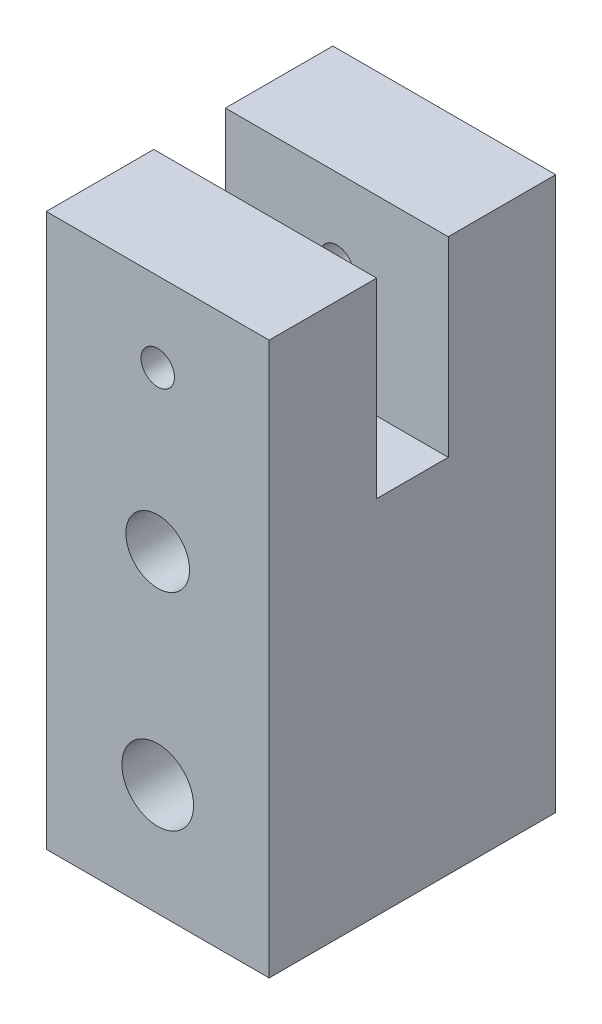
ISO-10303-21;
HEADER;
FILE_DESCRIPTION(('STEP AP214'),'2;1');
FILE_NAME('part.step','',(''),(''),'','','');
FILE_SCHEMA(('AUTOMOTIVE_DESIGN { 1 0 10303 214 1 1 1 1 }'));
ENDSEC;
DATA;
#1=APPLICATION_CONTEXT('core data for automotive mechanical design processes');
#2=APPLICATION_PROTOCOL_DEFINITION('international standard','automotive_design',2000,#1);
#3=PRODUCT_CONTEXT('',#1,'mechanical');
#4=PRODUCT('Part','Part','',(#3));
#5=PRODUCT_RELATED_PRODUCT_CATEGORY('part','',(#4));
#6=PRODUCT_DEFINITION_FORMATION('','',#4);
#7=PRODUCT_DEFINITION_CONTEXT('part definition',#1,'design');
#8=PRODUCT_DEFINITION('design','',#6,#7);
#9=PRODUCT_DEFINITION_SHAPE('','',#8);
#10=(LENGTH_UNIT() NAMED_UNIT(*) SI_UNIT(.MILLI.,.METRE.));
#11=(NAMED_UNIT(*) PLANE_ANGLE_UNIT() SI_UNIT($,.RADIAN.));
#12=(NAMED_UNIT(*) SI_UNIT($,.STERADIAN.) SOLID_ANGLE_UNIT());
#13=UNCERTAINTY_MEASURE_WITH_UNIT(LENGTH_MEASURE(1.E-05),#10,'distance_accuracy_value','');
#14=(GEOMETRIC_REPRESENTATION_CONTEXT(3) GLOBAL_UNCERTAINTY_ASSIGNED_CONTEXT((#13)) GLOBAL_UNIT_ASSIGNED_CONTEXT((#10,
#11,#12)) REPRESENTATION_CONTEXT('',''));
#15=CARTESIAN_POINT('',(0.,0.,0.));
#16=DIRECTION('',(0.,0.,1.));
#17=DIRECTION('',(1.,0.,0.));
#18=AXIS2_PLACEMENT_3D('',#15,#16,#17);
#19=CARTESIAN_POINT('',(-7.,17.35,18.));
#20=DIRECTION('',(0.,-1.,0.));
#21=DIRECTION('',(0.,0.,-1.));
#22=AXIS2_PLACEMENT_3D('',#19,#20,#21);
#23=PLANE('',#22);
#24=DIRECTION('',(0.,0.,-1.));
#25=VECTOR('',#24,1.);
#26=CARTESIAN_POINT('',(-7.,17.35,18.));
#27=LINE('',#26,#25);
#28=CARTESIAN_POINT('',(-7.,17.35,6.75));
#29=VERTEX_POINT('',#28);
#30=CARTESIAN_POINT('',(-7.,17.35,0.));
#31=VERTEX_POINT('',#30);
#32=EDGE_CURVE('E135',#29,#31,#27,.T.);
#33=ORIENTED_EDGE('',*,*,#32,.F.);
#34=DIRECTION('',(1.,0.,0.));
#35=VECTOR('',#34,1.);
#36=CARTESIAN_POINT('',(-0.999999999999999,17.35,6.75));
#37=LINE('',#36,#35);
#38=CARTESIAN_POINT('',(7.,17.35,6.75));
#39=VERTEX_POINT('',#38);
#40=EDGE_CURVE('E119',#29,#39,#37,.T.);
#41=ORIENTED_EDGE('',*,*,#40,.T.);
#42=DIRECTION('',(0.,0.,-1.));
#43=VECTOR('',#42,1.);
#44=CARTESIAN_POINT('',(7.,17.35,18.));
#45=LINE('',#44,#43);
#46=CARTESIAN_POINT('',(7.,17.35,0.));
#47=VERTEX_POINT('',#46);
#48=EDGE_CURVE('E42',#39,#47,#45,.T.);
#49=ORIENTED_EDGE('',*,*,#48,.T.);
#50=DIRECTION('',(-1.,0.,0.));
#51=VECTOR('',#50,1.);
#52=CARTESIAN_POINT('',(-7.,17.35,0.));
#53=LINE('',#52,#51);
#54=EDGE_CURVE('E143',#47,#31,#53,.T.);
#55=ORIENTED_EDGE('',*,*,#54,.T.);
#56=EDGE_LOOP('',(#33,#41,#49,#55));
#57=FACE_BOUND('',#56,.T.);
#58=ADVANCED_FACE('F33',(#57),#23,.F.);
#59=CARTESIAN_POINT('',(0.,12.35,0.));
#60=DIRECTION('',(0.,0.,1.));
#61=DIRECTION('',(1.,0.,0.));
#62=AXIS2_PLACEMENT_3D('',#59,#60,#61);
#63=CYLINDRICAL_SURFACE('',#62,1.05);
#64=CARTESIAN_POINT('',(0.,12.35,0.));
#65=DIRECTION('',(0.,0.,1.));
#66=DIRECTION('',(1.,0.,0.));
#67=AXIS2_PLACEMENT_3D('',#64,#65,#66);
#68=CIRCLE('',#67,1.05);
#69=CARTESIAN_POINT('',(1.05,12.35,0.));
#70=VERTEX_POINT('',#69);
#71=EDGE_CURVE('E200',#70,#70,#68,.T.);
#72=ORIENTED_EDGE('',*,*,#71,.F.);
#73=EDGE_LOOP('',(#72));
#74=FACE_BOUND('',#73,.T.);
#75=CARTESIAN_POINT('',(0.,12.35,6.75));
#76=DIRECTION('',(0.,0.,-1.));
#77=DIRECTION('',(0.,1.,0.));
#78=AXIS2_PLACEMENT_3D('',#75,#76,#77);
#79=CIRCLE('',#78,1.05);
#80=CARTESIAN_POINT('',(0.,13.4,6.75));
#81=VERTEX_POINT('',#80);
#82=EDGE_CURVE('E188',#81,#81,#79,.T.);
#83=ORIENTED_EDGE('',*,*,#82,.F.);
#84=EDGE_LOOP('',(#83));
#85=FACE_BOUND('',#84,.T.);
#86=ADVANCED_FACE('F253',(#74,#85),#63,.F.);
#87=CARTESIAN_POINT('',(-0.999999999999999,0.,0.));
#88=DIRECTION('',(-1.,0.,0.));
#89=DIRECTION('',(0.,0.,1.));
#90=AXIS2_PLACEMENT_3D('',#87,#88,#89);
#91=PLANE('',#90);
#92=DIRECTION('',(0.,1.,0.));
#93=VECTOR('',#92,1.);
#94=CARTESIAN_POINT('',(-0.999999999999999,5.35,6.75));
#95=LINE('',#94,#93);
#96=CARTESIAN_POINT('',(-0.999999999999999,5.35,6.75));
#97=VERTEX_POINT('',#96);
#98=CARTESIAN_POINT('',(-0.999999999999999,10.35,6.75));
#99=VERTEX_POINT('',#98);
#100=EDGE_CURVE('E184',#97,#99,#95,.T.);
#101=ORIENTED_EDGE('',*,*,#100,.T.);
#102=DIRECTION('',(0.,0.,1.));
#103=VECTOR('',#102,1.);
#104=CARTESIAN_POINT('',(-0.999999999999999,10.35,0.));
#105=LINE('',#104,#103);
#106=CARTESIAN_POINT('',(-0.999999999999999,10.35,11.25));
#107=VERTEX_POINT('',#106);
#108=EDGE_CURVE('E204',#99,#107,#105,.T.);
#109=ORIENTED_EDGE('',*,*,#108,.T.);
#110=DIRECTION('',(0.,-1.,0.));
#111=VECTOR('',#110,1.);
#112=CARTESIAN_POINT('',(-0.999999999999999,5.35,11.25));
#113=LINE('',#112,#111);
#114=CARTESIAN_POINT('',(-0.999999999999999,5.35,11.25));
#115=VERTEX_POINT('',#114);
#116=EDGE_CURVE('E191',#107,#115,#113,.T.);
#117=ORIENTED_EDGE('',*,*,#116,.T.);
#118=DIRECTION('',(0.,0.,-1.));
#119=VECTOR('',#118,1.);
#120=CARTESIAN_POINT('',(-0.999999999999999,5.35,11.25));
#121=LINE('',#120,#119);
#122=EDGE_CURVE('E132',#115,#97,#121,.T.);
#123=ORIENTED_EDGE('',*,*,#122,.T.);
#124=EDGE_LOOP('',(#101,#109,#117,#123));
#125=FACE_BOUND('',#124,.T.);
#126=ADVANCED_FACE('F226',(#125),#91,.F.);
#127=CARTESIAN_POINT('',(7.,-17.35,18.));
#128=DIRECTION('',(-1.,0.,0.));
#129=DIRECTION('',(0.,0.,1.));
#130=AXIS2_PLACEMENT_3D('',#127,#128,#129);
#131=PLANE('',#130);
#132=ORIENTED_EDGE('',*,*,#48,.F.);
#133=DIRECTION('',(0.,1.,0.));
#134=VECTOR('',#133,1.);
#135=CARTESIAN_POINT('',(7.,5.35,6.75));
#136=LINE('',#135,#134);
#137=CARTESIAN_POINT('',(7.,5.35,6.75));
#138=VERTEX_POINT('',#137);
#139=EDGE_CURVE('E127',#138,#39,#136,.T.);
#140=ORIENTED_EDGE('',*,*,#139,.F.);
#141=DIRECTION('',(0.,0.,-1.));
#142=VECTOR('',#141,1.);
#143=CARTESIAN_POINT('',(7.,5.35,11.25));
#144=LINE('',#143,#142);
#145=CARTESIAN_POINT('',(7.,5.35,11.25));
#146=VERTEX_POINT('',#145);
#147=EDGE_CURVE('E181',#146,#138,#144,.T.);
#148=ORIENTED_EDGE('',*,*,#147,.F.);
#149=DIRECTION('',(0.,-1.,0.));
#150=VECTOR('',#149,1.);
#151=CARTESIAN_POINT('',(7.,5.35,11.25));
#152=LINE('',#151,#150);
#153=CARTESIAN_POINT('',(7.,17.35,11.25));
#154=VERTEX_POINT('',#153);
#155=EDGE_CURVE('E185',#154,#146,#152,.T.);
#156=ORIENTED_EDGE('',*,*,#155,.F.);
#157=CARTESIAN_POINT('',(7.,17.35,18.));
#158=VERTEX_POINT('',#157);
#159=EDGE_CURVE('E11',#158,#154,#45,.T.);
#160=ORIENTED_EDGE('',*,*,#159,.F.);
#161=DIRECTION('',(0.,1.,0.));
#162=VECTOR('',#161,1.);
#163=CARTESIAN_POINT('',(7.,-17.35,18.));
#164=LINE('',#163,#162);
#165=CARTESIAN_POINT('',(7.,-17.35,18.));
#166=VERTEX_POINT('',#165);
#167=EDGE_CURVE('E152',#166,#158,#164,.T.);
#168=ORIENTED_EDGE('',*,*,#167,.F.);
#169=DIRECTION('',(0.,0.,-1.));
#170=VECTOR('',#169,1.);
#171=CARTESIAN_POINT('',(7.,-17.35,18.));
#172=LINE('',#171,#170);
#173=CARTESIAN_POINT('',(7.,-17.35,0.));
#174=VERTEX_POINT('',#173);
#175=EDGE_CURVE('E147',#166,#174,#172,.T.);
#176=ORIENTED_EDGE('',*,*,#175,.T.);
#177=DIRECTION('',(0.,1.,0.));
#178=VECTOR('',#177,1.);
#179=CARTESIAN_POINT('',(7.,-17.35,0.));
#180=LINE('',#179,#178);
#181=EDGE_CURVE('E155',#174,#47,#180,.T.);
#182=ORIENTED_EDGE('',*,*,#181,.T.);
#183=EDGE_LOOP('',(#132,#140,#148,#156,#160,#168,#176,#182));
#184=FACE_BOUND('',#183,.T.);
#185=ADVANCED_FACE('F35',(#184),#131,.F.);
#186=DIRECTION('',(1.,0.,0.));
#187=VECTOR('',#186,1.);
#188=CARTESIAN_POINT('',(-0.999999999999999,17.35,11.25));
#189=LINE('',#188,#187);
#190=CARTESIAN_POINT('',(-7.,17.35,11.25));
#191=VERTEX_POINT('',#190);
#192=EDGE_CURVE('E131',#191,#154,#189,.T.);
#193=ORIENTED_EDGE('',*,*,#192,.F.);
#194=CARTESIAN_POINT('',(-7.,17.35,18.));
#195=VERTEX_POINT('',#194);
#196=EDGE_CURVE('E144',#195,#191,#27,.T.);
#197=ORIENTED_EDGE('',*,*,#196,.F.);
#198=DIRECTION('',(-1.,0.,0.));
#199=VECTOR('',#198,1.);
#200=CARTESIAN_POINT('',(-7.,17.35,18.));
#201=LINE('',#200,#199);
#202=EDGE_CURVE('E80',#158,#195,#201,.T.);
#203=ORIENTED_EDGE('',*,*,#202,.F.);
#204=ORIENTED_EDGE('',*,*,#159,.T.);
#205=EDGE_LOOP('',(#193,#197,#203,#204));
#206=FACE_BOUND('',#205,.T.);
#207=ADVANCED_FACE('F254',(#206),#23,.F.);
#208=CARTESIAN_POINT('',(-7.,-17.35,18.));
#209=DIRECTION('',(1.,0.,0.));
#210=DIRECTION('',(0.,0.,-1.));
#211=AXIS2_PLACEMENT_3D('',#208,#209,#210);
#212=PLANE('',#211);
#213=DIRECTION('',(0.,0.,-1.));
#214=VECTOR('',#213,1.);
#215=CARTESIAN_POINT('',(-7.,10.35,6.75));
#216=LINE('',#215,#214);
#217=CARTESIAN_POINT('',(-7.,10.35,11.25));
#218=VERTEX_POINT('',#217);
#219=CARTESIAN_POINT('',(-7.,10.35,6.75));
#220=VERTEX_POINT('',#219);
#221=EDGE_CURVE('E139',#218,#220,#216,.T.);
#222=ORIENTED_EDGE('',*,*,#221,.T.);
#223=DIRECTION('',(0.,1.,0.));
#224=VECTOR('',#223,1.);
#225=CARTESIAN_POINT('',(-7.,17.35,6.75));
#226=LINE('',#225,#224);
#227=EDGE_CURVE('E124',#220,#29,#226,.T.);
#228=ORIENTED_EDGE('',*,*,#227,.T.);
#229=ORIENTED_EDGE('',*,*,#32,.T.);
#230=DIRECTION('',(0.,-1.,0.));
#231=VECTOR('',#230,1.);
#232=CARTESIAN_POINT('',(-7.,-17.35,0.));
#233=LINE('',#232,#231);
#234=CARTESIAN_POINT('',(-7.,-17.35,0.));
#235=VERTEX_POINT('',#234);
#236=EDGE_CURVE('E67',#31,#235,#233,.T.);
#237=ORIENTED_EDGE('',*,*,#236,.T.);
#238=DIRECTION('',(0.,0.,-1.));
#239=VECTOR('',#238,1.);
#240=CARTESIAN_POINT('',(-7.,-17.35,18.));
#241=LINE('',#240,#239);
#242=CARTESIAN_POINT('',(-7.,-17.35,18.));
#243=VERTEX_POINT('',#242);
#244=EDGE_CURVE('E145',#243,#235,#241,.T.);
#245=ORIENTED_EDGE('',*,*,#244,.F.);
#246=DIRECTION('',(0.,-1.,0.));
#247=VECTOR('',#246,1.);
#248=CARTESIAN_POINT('',(-7.,-17.35,18.));
#249=LINE('',#248,#247);
#250=EDGE_CURVE('E160',#195,#243,#249,.T.);
#251=ORIENTED_EDGE('',*,*,#250,.F.);
#252=ORIENTED_EDGE('',*,*,#196,.T.);
#253=DIRECTION('',(0.,-1.,0.));
#254=VECTOR('',#253,1.);
#255=CARTESIAN_POINT('',(-7.,17.35,11.25));
#256=LINE('',#255,#254);
#257=EDGE_CURVE('E140',#191,#218,#256,.T.);
#258=ORIENTED_EDGE('',*,*,#257,.T.);
#259=EDGE_LOOP('',(#222,#228,#229,#237,#245,#251,#252,#258));
#260=FACE_BOUND('',#259,.T.);
#261=ADVANCED_FACE('F134',(#260),#212,.F.);
#262=CARTESIAN_POINT('',(-7.,-17.35,18.));
#263=DIRECTION('',(0.,1.,0.));
#264=DIRECTION('',(0.,0.,1.));
#265=AXIS2_PLACEMENT_3D('',#262,#263,#264);
#266=PLANE('',#265);
#267=DIRECTION('',(1.,0.,0.));
#268=VECTOR('',#267,1.);
#269=CARTESIAN_POINT('',(-7.,-17.35,0.));
#270=LINE('',#269,#268);
#271=EDGE_CURVE('E73',#235,#174,#270,.T.);
#272=ORIENTED_EDGE('',*,*,#271,.T.);
#273=ORIENTED_EDGE('',*,*,#175,.F.);
#274=DIRECTION('',(1.,0.,0.));
#275=VECTOR('',#274,1.);
#276=CARTESIAN_POINT('',(-7.,-17.35,18.));
#277=LINE('',#276,#275);
#278=EDGE_CURVE('E50',#243,#166,#277,.T.);
#279=ORIENTED_EDGE('',*,*,#278,.F.);
#280=ORIENTED_EDGE('',*,*,#244,.T.);
#281=EDGE_LOOP('',(#272,#273,#279,#280));
#282=FACE_BOUND('',#281,.T.);
#283=ADVANCED_FACE('F247',(#282),#266,.F.);
#284=CARTESIAN_POINT('',(0.,0.,18.));
#285=DIRECTION('',(0.,0.,-1.));
#286=DIRECTION('',(-1.,0.,0.));
#287=AXIS2_PLACEMENT_3D('',#284,#285,#286);
#288=PLANE('',#287);
#289=CARTESIAN_POINT('',(0.,12.35,18.));
#290=DIRECTION('',(0.,0.,1.));
#291=DIRECTION('',(1.,0.,0.));
#292=AXIS2_PLACEMENT_3D('',#289,#290,#291);
#293=CIRCLE('',#292,1.05);
#294=CARTESIAN_POINT('',(1.05,12.35,18.));
#295=VERTEX_POINT('',#294);
#296=EDGE_CURVE('E201',#295,#295,#293,.T.);
#297=ORIENTED_EDGE('',*,*,#296,.F.);
#298=EDGE_LOOP('',(#297));
#299=FACE_BOUND('',#298,.T.);
#300=CARTESIAN_POINT('',(0.,2.34999999999999,18.));
#301=DIRECTION('',(0.,0.,1.));
#302=DIRECTION('',(1.,0.,0.));
#303=AXIS2_PLACEMENT_3D('',#300,#301,#302);
#304=CIRCLE('',#303,2.);
#305=CARTESIAN_POINT('',(2.,2.34999999999999,18.));
#306=VERTEX_POINT('',#305);
#307=EDGE_CURVE('E170',#306,#306,#304,.T.);
#308=ORIENTED_EDGE('',*,*,#307,.F.);
#309=EDGE_LOOP('',(#308));
#310=FACE_BOUND('',#309,.T.);
#311=CARTESIAN_POINT('',(0.,-10.35,18.));
#312=DIRECTION('',(0.,0.,1.));
#313=DIRECTION('',(1.,0.,0.));
#314=AXIS2_PLACEMENT_3D('',#311,#312,#313);
#315=CIRCLE('',#314,2.25);
#316=CARTESIAN_POINT('',(2.25,-10.35,18.));
#317=VERTEX_POINT('',#316);
#318=EDGE_CURVE('E164',#317,#317,#315,.T.);
#319=ORIENTED_EDGE('',*,*,#318,.F.);
#320=EDGE_LOOP('',(#319));
#321=FACE_BOUND('',#320,.T.);
#322=ORIENTED_EDGE('',*,*,#167,.T.);
#323=ORIENTED_EDGE('',*,*,#202,.T.);
#324=ORIENTED_EDGE('',*,*,#250,.T.);
#325=ORIENTED_EDGE('',*,*,#278,.T.);
#326=EDGE_LOOP('',(#322,#323,#324,#325));
#327=FACE_BOUND('',#326,.T.);
#328=ADVANCED_FACE('F237',(#299,#310,#321,#327),#288,.F.);
#329=CARTESIAN_POINT('',(0.,0.,0.));
#330=DIRECTION('',(0.,0.,-1.));
#331=DIRECTION('',(-1.,0.,0.));
#332=AXIS2_PLACEMENT_3D('',#329,#330,#331);
#333=PLANE('',#332);
#334=ORIENTED_EDGE('',*,*,#71,.T.);
#335=EDGE_LOOP('',(#334));
#336=FACE_BOUND('',#335,.T.);
#337=CARTESIAN_POINT('',(0.,2.34999999999999,0.));
#338=DIRECTION('',(0.,0.,1.));
#339=DIRECTION('',(1.,0.,0.));
#340=AXIS2_PLACEMENT_3D('',#337,#338,#339);
#341=CIRCLE('',#340,2.);
#342=CARTESIAN_POINT('',(2.,2.34999999999999,0.));
#343=VERTEX_POINT('',#342);
#344=EDGE_CURVE('E167',#343,#343,#341,.T.);
#345=ORIENTED_EDGE('',*,*,#344,.T.);
#346=EDGE_LOOP('',(#345));
#347=FACE_BOUND('',#346,.T.);
#348=CARTESIAN_POINT('',(0.,-10.35,0.));
#349=DIRECTION('',(0.,0.,1.));
#350=DIRECTION('',(1.,0.,0.));
#351=AXIS2_PLACEMENT_3D('',#348,#349,#350);
#352=CIRCLE('',#351,2.25);
#353=CARTESIAN_POINT('',(2.25,-10.35,0.));
#354=VERTEX_POINT('',#353);
#355=EDGE_CURVE('E158',#354,#354,#352,.T.);
#356=ORIENTED_EDGE('',*,*,#355,.T.);
#357=EDGE_LOOP('',(#356));
#358=FACE_BOUND('',#357,.T.);
#359=ORIENTED_EDGE('',*,*,#181,.F.);
#360=ORIENTED_EDGE('',*,*,#271,.F.);
#361=ORIENTED_EDGE('',*,*,#236,.F.);
#362=ORIENTED_EDGE('',*,*,#54,.F.);
#363=EDGE_LOOP('',(#359,#360,#361,#362));
#364=FACE_BOUND('',#363,.T.);
#365=ADVANCED_FACE('F234',(#336,#347,#358,#364),#333,.T.);
#366=CARTESIAN_POINT('',(0.,-10.35,0.));
#367=DIRECTION('',(0.,0.,1.));
#368=DIRECTION('',(1.,0.,0.));
#369=AXIS2_PLACEMENT_3D('',#366,#367,#368);
#370=CYLINDRICAL_SURFACE('',#369,2.25);
#371=ORIENTED_EDGE('',*,*,#355,.F.);
#372=EDGE_LOOP('',(#371));
#373=FACE_BOUND('',#372,.T.);
#374=ORIENTED_EDGE('',*,*,#318,.T.);
#375=EDGE_LOOP('',(#374));
#376=FACE_BOUND('',#375,.T.);
#377=ADVANCED_FACE('F236',(#373,#376),#370,.F.);
#378=CARTESIAN_POINT('',(0.,2.34999999999999,0.));
#379=DIRECTION('',(0.,0.,1.));
#380=DIRECTION('',(1.,0.,0.));
#381=AXIS2_PLACEMENT_3D('',#378,#379,#380);
#382=CYLINDRICAL_SURFACE('',#381,2.);
#383=ORIENTED_EDGE('',*,*,#344,.F.);
#384=EDGE_LOOP('',(#383));
#385=FACE_BOUND('',#384,.T.);
#386=ORIENTED_EDGE('',*,*,#307,.T.);
#387=EDGE_LOOP('',(#386));
#388=FACE_BOUND('',#387,.T.);
#389=ADVANCED_FACE('F244',(#385,#388),#382,.F.);
#390=CARTESIAN_POINT('',(-0.999999999999999,5.35,6.75));
#391=DIRECTION('',(0.,0.,-1.));
#392=DIRECTION('',(0.,1.,0.));
#393=AXIS2_PLACEMENT_3D('',#390,#391,#392);
#394=PLANE('',#393);
#395=DIRECTION('',(1.,0.,0.));
#396=VECTOR('',#395,1.);
#397=CARTESIAN_POINT('',(-7.,10.35,6.75));
#398=LINE('',#397,#396);
#399=EDGE_CURVE('E209',#220,#99,#398,.T.);
#400=ORIENTED_EDGE('',*,*,#399,.T.);
#401=ORIENTED_EDGE('',*,*,#100,.F.);
#402=DIRECTION('',(1.,0.,0.));
#403=VECTOR('',#402,1.);
#404=CARTESIAN_POINT('',(-0.999999999999999,5.35,6.75));
#405=LINE('',#404,#403);
#406=EDGE_CURVE('E173',#97,#138,#405,.T.);
#407=ORIENTED_EDGE('',*,*,#406,.T.);
#408=ORIENTED_EDGE('',*,*,#139,.T.);
#409=ORIENTED_EDGE('',*,*,#40,.F.);
#410=ORIENTED_EDGE('',*,*,#227,.F.);
#411=EDGE_LOOP('',(#400,#401,#407,#408,#409,#410));
#412=FACE_BOUND('',#411,.T.);
#413=ORIENTED_EDGE('',*,*,#82,.T.);
#414=EDGE_LOOP('',(#413));
#415=FACE_BOUND('',#414,.T.);
#416=ADVANCED_FACE('F122',(#412,#415),#394,.F.);
#417=CARTESIAN_POINT('',(-0.999999999999999,5.35,11.25));
#418=DIRECTION('',(0.,-1.,0.));
#419=DIRECTION('',(0.,0.,-1.));
#420=AXIS2_PLACEMENT_3D('',#417,#418,#419);
#421=PLANE('',#420);
#422=ORIENTED_EDGE('',*,*,#147,.T.);
#423=ORIENTED_EDGE('',*,*,#406,.F.);
#424=ORIENTED_EDGE('',*,*,#122,.F.);
#425=DIRECTION('',(1.,0.,0.));
#426=VECTOR('',#425,1.);
#427=CARTESIAN_POINT('',(-0.999999999999999,5.35,11.25));
#428=LINE('',#427,#426);
#429=EDGE_CURVE('E177',#115,#146,#428,.T.);
#430=ORIENTED_EDGE('',*,*,#429,.T.);
#431=EDGE_LOOP('',(#422,#423,#424,#430));
#432=FACE_BOUND('',#431,.T.);
#433=ADVANCED_FACE('F229',(#432),#421,.F.);
#434=CARTESIAN_POINT('',(-0.999999999999999,5.35,11.25));
#435=DIRECTION('',(0.,0.,1.));
#436=DIRECTION('',(1.,0.,0.));
#437=AXIS2_PLACEMENT_3D('',#434,#435,#436);
#438=PLANE('',#437);
#439=ORIENTED_EDGE('',*,*,#116,.F.);
#440=DIRECTION('',(1.,0.,0.));
#441=VECTOR('',#440,1.);
#442=CARTESIAN_POINT('',(-7.,10.35,11.25));
#443=LINE('',#442,#441);
#444=EDGE_CURVE('E210',#218,#107,#443,.T.);
#445=ORIENTED_EDGE('',*,*,#444,.F.);
#446=ORIENTED_EDGE('',*,*,#257,.F.);
#447=ORIENTED_EDGE('',*,*,#192,.T.);
#448=ORIENTED_EDGE('',*,*,#155,.T.);
#449=ORIENTED_EDGE('',*,*,#429,.F.);
#450=EDGE_LOOP('',(#439,#445,#446,#447,#448,#449));
#451=FACE_BOUND('',#450,.T.);
#452=CARTESIAN_POINT('',(0.,12.35,11.25));
#453=DIRECTION('',(0.,0.,1.));
#454=DIRECTION('',(1.,0.,0.));
#455=AXIS2_PLACEMENT_3D('',#452,#453,#454);
#456=CIRCLE('',#455,1.05);
#457=CARTESIAN_POINT('',(1.05,12.35,11.25));
#458=VERTEX_POINT('',#457);
#459=EDGE_CURVE('E197',#458,#458,#456,.T.);
#460=ORIENTED_EDGE('',*,*,#459,.T.);
#461=EDGE_LOOP('',(#460));
#462=FACE_BOUND('',#461,.T.);
#463=ADVANCED_FACE('F218',(#451,#462),#438,.F.);
#464=ORIENTED_EDGE('',*,*,#296,.T.);
#465=EDGE_LOOP('',(#464));
#466=FACE_BOUND('',#465,.T.);
#467=ORIENTED_EDGE('',*,*,#459,.F.);
#468=EDGE_LOOP('',(#467));
#469=FACE_BOUND('',#468,.T.);
#470=ADVANCED_FACE('F260',(#466,#469),#63,.F.);
#471=CARTESIAN_POINT('',(-7.,10.35,6.75));
#472=DIRECTION('',(0.,-1.,0.));
#473=DIRECTION('',(0.,0.,-1.));
#474=AXIS2_PLACEMENT_3D('',#471,#472,#473);
#475=PLANE('',#474);
#476=ORIENTED_EDGE('',*,*,#399,.F.);
#477=ORIENTED_EDGE('',*,*,#221,.F.);
#478=ORIENTED_EDGE('',*,*,#444,.T.);
#479=ORIENTED_EDGE('',*,*,#108,.F.);
#480=EDGE_LOOP('',(#476,#477,#478,#479));
#481=FACE_BOUND('',#480,.T.);
#482=ADVANCED_FACE('F223',(#481),#475,.F.);
#483=CLOSED_SHELL('',(#58,#86,#126,#185,#207,#261,#283,#328,#365,#377,#389,#416,#433,#463,#470,#482));
#484=MANIFOLD_SOLID_BREP('B2',#483);
#485=ADVANCED_BREP_SHAPE_REPRESENTATION('',(#18,#484),#14);
#486=SHAPE_DEFINITION_REPRESENTATION(#9,#485);
ENDSEC;
END-ISO-10303-21;
